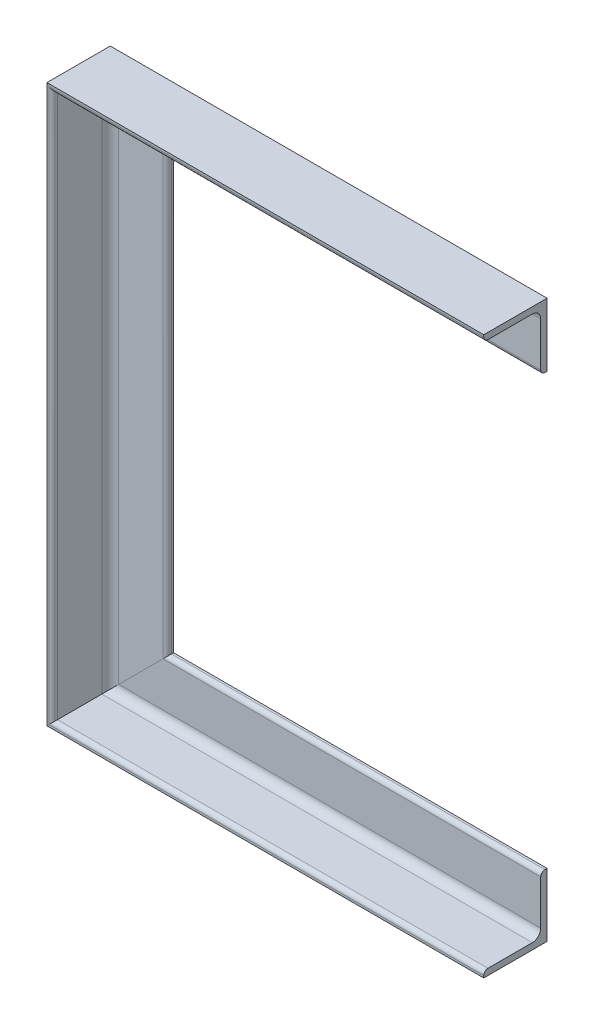
ISO-10303-21;
HEADER;
FILE_DESCRIPTION(('STEP AP214'),'2;1');
FILE_NAME('part.step','',(''),(''),'','','');
FILE_SCHEMA(('AUTOMOTIVE_DESIGN { 1 0 10303 214 1 1 1 1 }'));
ENDSEC;
DATA;
#1=APPLICATION_CONTEXT('core data for automotive mechanical design processes');
#2=APPLICATION_PROTOCOL_DEFINITION('international standard','automotive_design',2000,#1);
#3=PRODUCT_CONTEXT('',#1,'mechanical');
#4=PRODUCT('Part','Part','',(#3));
#5=PRODUCT_RELATED_PRODUCT_CATEGORY('part','',(#4));
#6=PRODUCT_DEFINITION_FORMATION('','',#4);
#7=PRODUCT_DEFINITION_CONTEXT('part definition',#1,'design');
#8=PRODUCT_DEFINITION('design','',#6,#7);
#9=PRODUCT_DEFINITION_SHAPE('','',#8);
#10=(LENGTH_UNIT() NAMED_UNIT(*) SI_UNIT(.MILLI.,.METRE.));
#11=(NAMED_UNIT(*) PLANE_ANGLE_UNIT() SI_UNIT($,.RADIAN.));
#12=(NAMED_UNIT(*) SI_UNIT($,.STERADIAN.) SOLID_ANGLE_UNIT());
#13=UNCERTAINTY_MEASURE_WITH_UNIT(LENGTH_MEASURE(1.E-05),#10,'distance_accuracy_value','');
#14=(GEOMETRIC_REPRESENTATION_CONTEXT(3) GLOBAL_UNCERTAINTY_ASSIGNED_CONTEXT((#13)) GLOBAL_UNIT_ASSIGNED_CONTEXT((#10,
#11,#12)) REPRESENTATION_CONTEXT('',''));
#15=CARTESIAN_POINT('',(0.,0.,0.));
#16=DIRECTION('',(0.,0.,1.));
#17=DIRECTION('',(1.,0.,0.));
#18=AXIS2_PLACEMENT_3D('',#15,#16,#17);
#19=CARTESIAN_POINT('',(-200.,512.,50.));
#20=DIRECTION('',(1.,0.,0.));
#21=DIRECTION('',(0.,1.,0.));
#22=AXIS2_PLACEMENT_3D('',#19,#20,#21);
#23=CYLINDRICAL_SURFACE('',#22,4.);
#24=CARTESIAN_POINT('',(200.,512.,50.));
#25=DIRECTION('',(1.,0.,0.));
#26=DIRECTION('',(0.,1.,0.));
#27=AXIS2_PLACEMENT_3D('',#24,#25,#26);
#28=CIRCLE('',#27,4.);
#29=CARTESIAN_POINT('',(200.,508.,50.));
#30=VERTEX_POINT('',#29);
#31=CARTESIAN_POINT('',(200.,512.,54.));
#32=VERTEX_POINT('',#31);
#33=EDGE_CURVE('P0_E157',#30,#32,#28,.F.);
#34=ORIENTED_EDGE('',*,*,#33,.T.);
#35=DIRECTION('',(1.,0.,0.));
#36=VECTOR('',#35,1.);
#37=CARTESIAN_POINT('',(-200.,512.,54.));
#38=LINE('',#37,#36);
#39=CARTESIAN_POINT('',(-212.,512.,54.));
#40=VERTEX_POINT('',#39);
#41=EDGE_CURVE('P0_E146',#32,#40,#38,.F.);
#42=ORIENTED_EDGE('',*,*,#41,.T.);
#43=CARTESIAN_POINT('',(-212.,512.,50.));
#44=DIRECTION('',(-0.707106781186548,-0.707106781186548,0.));
#45=DIRECTION('',(0.707106781186548,-0.707106781186548,0.));
#46=AXIS2_PLACEMENT_3D('',#43,#44,#45);
#47=ELLIPSE('',#46,5.65685424949238,4.);
#48=CARTESIAN_POINT('',(-208.,508.,50.));
#49=VERTEX_POINT('',#48);
#50=EDGE_CURVE('P0_E149',#49,#40,#47,.T.);
#51=ORIENTED_EDGE('',*,*,#50,.F.);
#52=DIRECTION('',(1.,0.,0.));
#53=VECTOR('',#52,1.);
#54=CARTESIAN_POINT('',(-200.,508.,50.));
#55=LINE('',#54,#53);
#56=EDGE_CURVE('P0_E124',#49,#30,#55,.T.);
#57=ORIENTED_EDGE('',*,*,#56,.T.);
#58=EDGE_LOOP('',(#34,#42,#51,#57));
#59=FACE_BOUND('',#58,.T.);
#60=ADVANCED_FACE('P0_F17',(#59),#23,.T.);
#61=CARTESIAN_POINT('',(-200.,454.,-4.00000000000004));
#62=DIRECTION('',(0.,1.,0.));
#63=DIRECTION('',(0.,0.,1.));
#64=AXIS2_PLACEMENT_3D('',#61,#62,#63);
#65=PLANE('',#64);
#66=DIRECTION('',(1.,0.,0.));
#67=VECTOR('',#66,1.);
#68=CARTESIAN_POINT('',(-200.,454.,-5.99999999999999));
#69=LINE('',#68,#67);
#70=CARTESIAN_POINT('',(-154.,454.,-6.));
#71=VERTEX_POINT('',#70);
#72=CARTESIAN_POINT('',(200.,454.,-6.));
#73=VERTEX_POINT('',#72);
#74=EDGE_CURVE('P0_E115',#71,#73,#69,.T.);
#75=ORIENTED_EDGE('',*,*,#74,.T.);
#76=DIRECTION('',(0.,0.,1.));
#77=VECTOR('',#76,1.);
#78=CARTESIAN_POINT('',(200.,454.,50.));
#79=LINE('',#78,#77);
#80=CARTESIAN_POINT('',(200.,454.,-4.00000000000002));
#81=VERTEX_POINT('',#80);
#82=EDGE_CURVE('P0_E110',#73,#81,#79,.T.);
#83=ORIENTED_EDGE('',*,*,#82,.T.);
#84=DIRECTION('',(1.,0.,0.));
#85=VECTOR('',#84,1.);
#86=CARTESIAN_POINT('',(-200.,454.,-4.00000000000003));
#87=LINE('',#86,#85);
#88=CARTESIAN_POINT('',(-154.,454.,-4.00000000000002));
#89=VERTEX_POINT('',#88);
#90=EDGE_CURVE('P0_E84',#89,#81,#87,.T.);
#91=ORIENTED_EDGE('',*,*,#90,.F.);
#92=DIRECTION('',(0.,0.,1.));
#93=VECTOR('',#92,1.);
#94=CARTESIAN_POINT('',(-154.,454.,0.));
#95=LINE('',#94,#93);
#96=EDGE_CURVE('P0_E131',#71,#89,#95,.T.);
#97=ORIENTED_EDGE('',*,*,#96,.F.);
#98=EDGE_LOOP('',(#75,#83,#91,#97));
#99=FACE_BOUND('',#98,.T.);
#100=ADVANCED_FACE('P0_F201',(#99),#65,.F.);
#101=CARTESIAN_POINT('',(-200.,458.,-4.00000000000001));
#102=DIRECTION('',(1.,0.,0.));
#103=DIRECTION('',(0.,1.,0.));
#104=AXIS2_PLACEMENT_3D('',#101,#102,#103);
#105=CYLINDRICAL_SURFACE('',#104,4.);
#106=CARTESIAN_POINT('',(200.,458.,-4.00000000000001));
#107=DIRECTION('',(1.,0.,0.));
#108=DIRECTION('',(0.,1.,0.));
#109=AXIS2_PLACEMENT_3D('',#106,#107,#108);
#110=CIRCLE('',#109,4.);
#111=CARTESIAN_POINT('',(200.,458.,0.));
#112=VERTEX_POINT('',#111);
#113=EDGE_CURVE('P0_E20',#81,#112,#110,.F.);
#114=ORIENTED_EDGE('',*,*,#113,.T.);
#115=DIRECTION('',(1.,0.,0.));
#116=VECTOR('',#115,1.);
#117=CARTESIAN_POINT('',(-200.,458.,0.));
#118=LINE('',#117,#116);
#119=CARTESIAN_POINT('',(-158.,458.,0.));
#120=VERTEX_POINT('',#119);
#121=EDGE_CURVE('P0_E91',#112,#120,#118,.F.);
#122=ORIENTED_EDGE('',*,*,#121,.T.);
#123=CARTESIAN_POINT('',(-158.,458.,-4.00000000000001));
#124=DIRECTION('',(-0.707106781186548,-0.707106781186548,0.));
#125=DIRECTION('',(0.707106781186548,-0.707106781186548,0.));
#126=AXIS2_PLACEMENT_3D('',#123,#124,#125);
#127=ELLIPSE('',#126,5.65685424949238,4.);
#128=EDGE_CURVE('P0_E168',#89,#120,#127,.T.);
#129=ORIENTED_EDGE('',*,*,#128,.F.);
#130=ORIENTED_EDGE('',*,*,#90,.T.);
#131=EDGE_LOOP('',(#114,#122,#129,#130));
#132=FACE_BOUND('',#131,.T.);
#133=ADVANCED_FACE('P0_F109',(#132),#105,.T.);
#134=CARTESIAN_POINT('',(-200.,500.,0.));
#135=DIRECTION('',(0.,0.,-1.));
#136=DIRECTION('',(0.,1.,0.));
#137=AXIS2_PLACEMENT_3D('',#134,#135,#136);
#138=PLANE('',#137);
#139=ORIENTED_EDGE('',*,*,#121,.F.);
#140=DIRECTION('',(0.,-1.,0.));
#141=VECTOR('',#140,1.);
#142=CARTESIAN_POINT('',(200.,512.,0.));
#143=LINE('',#142,#141);
#144=CARTESIAN_POINT('',(200.,500.,0.));
#145=VERTEX_POINT('',#144);
#146=EDGE_CURVE('P0_E95',#112,#145,#143,.F.);
#147=ORIENTED_EDGE('',*,*,#146,.T.);
#148=DIRECTION('',(1.,0.,0.));
#149=VECTOR('',#148,1.);
#150=CARTESIAN_POINT('',(-200.,500.,0.));
#151=LINE('',#150,#149);
#152=CARTESIAN_POINT('',(-200.,500.,0.));
#153=VERTEX_POINT('',#152);
#154=EDGE_CURVE('P0_E97',#145,#153,#151,.F.);
#155=ORIENTED_EDGE('',*,*,#154,.T.);
#156=DIRECTION('',(0.707106781186548,-0.707106781186548,0.));
#157=VECTOR('',#156,1.);
#158=CARTESIAN_POINT('',(-200.,500.,0.));
#159=LINE('',#158,#157);
#160=EDGE_CURVE('P0_E96',#120,#153,#159,.F.);
#161=ORIENTED_EDGE('',*,*,#160,.F.);
#162=EDGE_LOOP('',(#139,#147,#155,#161));
#163=FACE_BOUND('',#162,.T.);
#164=ADVANCED_FACE('P0_F93',(#163),#138,.F.);
#165=CARTESIAN_POINT('',(-200.,500.,8.));
#166=DIRECTION('',(1.,0.,0.));
#167=DIRECTION('',(0.,1.,0.));
#168=AXIS2_PLACEMENT_3D('',#165,#166,#167);
#169=CYLINDRICAL_SURFACE('',#168,8.);
#170=ORIENTED_EDGE('',*,*,#154,.F.);
#171=CARTESIAN_POINT('',(200.,500.,8.));
#172=DIRECTION('',(1.,0.,0.));
#173=DIRECTION('',(0.,1.,0.));
#174=AXIS2_PLACEMENT_3D('',#171,#172,#173);
#175=CIRCLE('',#174,8.);
#176=CARTESIAN_POINT('',(200.,508.,8.00000000000003));
#177=VERTEX_POINT('',#176);
#178=EDGE_CURVE('P0_E107',#145,#177,#175,.T.);
#179=ORIENTED_EDGE('',*,*,#178,.T.);
#180=DIRECTION('',(1.,0.,0.));
#181=VECTOR('',#180,1.);
#182=CARTESIAN_POINT('',(-200.,508.,8.00000000000006));
#183=LINE('',#182,#181);
#184=CARTESIAN_POINT('',(-208.,508.,8.00000000000003));
#185=VERTEX_POINT('',#184);
#186=EDGE_CURVE('P0_E121',#177,#185,#183,.F.);
#187=ORIENTED_EDGE('',*,*,#186,.T.);
#188=CARTESIAN_POINT('',(-200.,500.,8.));
#189=DIRECTION('',(-0.707106781186548,-0.707106781186548,0.));
#190=DIRECTION('',(0.707106781186548,-0.707106781186548,0.));
#191=AXIS2_PLACEMENT_3D('',#188,#189,#190);
#192=ELLIPSE('',#191,11.3137084989848,8.);
#193=EDGE_CURVE('P0_E166',#153,#185,#192,.F.);
#194=ORIENTED_EDGE('',*,*,#193,.F.);
#195=EDGE_LOOP('',(#170,#179,#187,#194));
#196=FACE_BOUND('',#195,.T.);
#197=ADVANCED_FACE('P0_F202',(#196),#169,.F.);
#198=CARTESIAN_POINT('',(-200.,508.,50.));
#199=DIRECTION('',(0.,1.,0.));
#200=DIRECTION('',(0.,0.,1.));
#201=AXIS2_PLACEMENT_3D('',#198,#199,#200);
#202=PLANE('',#201);
#203=ORIENTED_EDGE('',*,*,#186,.F.);
#204=DIRECTION('',(0.,0.,1.));
#205=VECTOR('',#204,1.);
#206=CARTESIAN_POINT('',(200.,508.,50.));
#207=LINE('',#206,#205);
#208=EDGE_CURVE('P0_E171',#177,#30,#207,.T.);
#209=ORIENTED_EDGE('',*,*,#208,.T.);
#210=ORIENTED_EDGE('',*,*,#56,.F.);
#211=DIRECTION('',(0.,0.,1.));
#212=VECTOR('',#211,1.);
#213=CARTESIAN_POINT('',(-208.,508.,0.));
#214=LINE('',#213,#212);
#215=EDGE_CURVE('P0_E141',#185,#49,#214,.T.);
#216=ORIENTED_EDGE('',*,*,#215,.F.);
#217=EDGE_LOOP('',(#203,#209,#210,#216));
#218=FACE_BOUND('',#217,.T.);
#219=ADVANCED_FACE('P0_F203',(#218),#202,.F.);
#220=CARTESIAN_POINT('',(-200.,514.,-6.));
#221=DIRECTION('',(0.,0.,1.));
#222=DIRECTION('',(0.,-1.,0.));
#223=AXIS2_PLACEMENT_3D('',#220,#221,#222);
#224=PLANE('',#223);
#225=DIRECTION('',(1.,0.,0.));
#226=VECTOR('',#225,1.);
#227=CARTESIAN_POINT('',(-200.,514.,-6.00000000000001));
#228=LINE('',#227,#226);
#229=CARTESIAN_POINT('',(-214.,514.,-6.00000000000001));
#230=VERTEX_POINT('',#229);
#231=CARTESIAN_POINT('',(200.,514.,-6.00000000000001));
#232=VERTEX_POINT('',#231);
#233=EDGE_CURVE('P0_E137',#230,#232,#228,.T.);
#234=ORIENTED_EDGE('',*,*,#233,.T.);
#235=DIRECTION('',(0.,-1.,0.));
#236=VECTOR('',#235,1.);
#237=CARTESIAN_POINT('',(200.,512.,-6.00000000000001));
#238=LINE('',#237,#236);
#239=EDGE_CURVE('P0_E111',#232,#73,#238,.T.);
#240=ORIENTED_EDGE('',*,*,#239,.T.);
#241=ORIENTED_EDGE('',*,*,#74,.F.);
#242=DIRECTION('',(0.707106781186548,-0.707106781186548,0.));
#243=VECTOR('',#242,1.);
#244=CARTESIAN_POINT('',(-200.,500.,-6.00000000000001));
#245=LINE('',#244,#243);
#246=EDGE_CURVE('P0_E128',#230,#71,#245,.T.);
#247=ORIENTED_EDGE('',*,*,#246,.F.);
#248=EDGE_LOOP('',(#234,#240,#241,#247));
#249=FACE_BOUND('',#248,.T.);
#250=ADVANCED_FACE('P0_F198',(#249),#224,.F.);
#251=CARTESIAN_POINT('',(200.,512.,50.));
#252=DIRECTION('',(-1.,0.,0.));
#253=DIRECTION('',(0.,-1.,0.));
#254=AXIS2_PLACEMENT_3D('',#251,#252,#253);
#255=PLANE('',#254);
#256=ORIENTED_EDGE('',*,*,#33,.F.);
#257=ORIENTED_EDGE('',*,*,#208,.F.);
#258=ORIENTED_EDGE('',*,*,#178,.F.);
#259=ORIENTED_EDGE('',*,*,#146,.F.);
#260=ORIENTED_EDGE('',*,*,#113,.F.);
#261=ORIENTED_EDGE('',*,*,#82,.F.);
#262=ORIENTED_EDGE('',*,*,#239,.F.);
#263=DIRECTION('',(0.,0.,-1.));
#264=VECTOR('',#263,1.);
#265=CARTESIAN_POINT('',(200.,514.,54.));
#266=LINE('',#265,#264);
#267=CARTESIAN_POINT('',(200.,514.,54.));
#268=VERTEX_POINT('',#267);
#269=EDGE_CURVE('P0_E140',#232,#268,#266,.F.);
#270=ORIENTED_EDGE('',*,*,#269,.T.);
#271=DIRECTION('',(0.,1.,0.));
#272=VECTOR('',#271,1.);
#273=CARTESIAN_POINT('',(200.,514.,54.));
#274=LINE('',#273,#272);
#275=EDGE_CURVE('P0_E150',#268,#32,#274,.F.);
#276=ORIENTED_EDGE('',*,*,#275,.T.);
#277=EDGE_LOOP('',(#256,#257,#258,#259,#260,#261,#262,#270,#276));
#278=FACE_BOUND('',#277,.T.);
#279=ADVANCED_FACE('P0_F102',(#278),#255,.F.);
#280=CARTESIAN_POINT('',(-200.,514.,54.));
#281=DIRECTION('',(0.,0.,-1.));
#282=DIRECTION('',(0.,1.,0.));
#283=AXIS2_PLACEMENT_3D('',#280,#281,#282);
#284=PLANE('',#283);
#285=ORIENTED_EDGE('',*,*,#41,.F.);
#286=ORIENTED_EDGE('',*,*,#275,.F.);
#287=DIRECTION('',(1.,0.,0.));
#288=VECTOR('',#287,1.);
#289=CARTESIAN_POINT('',(-200.,514.,54.));
#290=LINE('',#289,#288);
#291=CARTESIAN_POINT('',(-214.,514.,54.));
#292=VERTEX_POINT('',#291);
#293=EDGE_CURVE('P0_E26',#268,#292,#290,.F.);
#294=ORIENTED_EDGE('',*,*,#293,.T.);
#295=DIRECTION('',(0.707106781186548,-0.707106781186548,0.));
#296=VECTOR('',#295,1.);
#297=CARTESIAN_POINT('',(-200.,500.,54.));
#298=LINE('',#297,#296);
#299=EDGE_CURVE('P0_E34',#40,#292,#298,.F.);
#300=ORIENTED_EDGE('',*,*,#299,.F.);
#301=EDGE_LOOP('',(#285,#286,#294,#300));
#302=FACE_BOUND('',#301,.T.);
#303=ADVANCED_FACE('P0_F191',(#302),#284,.F.);
#304=CARTESIAN_POINT('',(-200.,500.,0.));
#305=DIRECTION('',(-0.707106781186548,-0.707106781186548,0.));
#306=DIRECTION('',(0.707106781186548,-0.707106781186548,0.));
#307=AXIS2_PLACEMENT_3D('',#304,#305,#306);
#308=PLANE('',#307);
#309=ORIENTED_EDGE('',*,*,#193,.T.);
#310=ORIENTED_EDGE('',*,*,#215,.T.);
#311=ORIENTED_EDGE('',*,*,#50,.T.);
#312=ORIENTED_EDGE('',*,*,#299,.T.);
#313=DIRECTION('',(0.,0.,-1.));
#314=VECTOR('',#313,1.);
#315=CARTESIAN_POINT('',(-214.,514.,54.));
#316=LINE('',#315,#314);
#317=EDGE_CURVE('P0_E11',#292,#230,#316,.T.);
#318=ORIENTED_EDGE('',*,*,#317,.T.);
#319=ORIENTED_EDGE('',*,*,#246,.T.);
#320=ORIENTED_EDGE('',*,*,#96,.T.);
#321=ORIENTED_EDGE('',*,*,#128,.T.);
#322=ORIENTED_EDGE('',*,*,#160,.T.);
#323=EDGE_LOOP('',(#309,#310,#311,#312,#318,#319,#320,#321,#322));
#324=FACE_BOUND('',#323,.T.);
#325=ADVANCED_FACE('P0_F186',(#324),#308,.T.);
#326=CARTESIAN_POINT('',(-200.,514.,54.));
#327=DIRECTION('',(0.,-1.,0.));
#328=DIRECTION('',(0.,0.,-1.));
#329=AXIS2_PLACEMENT_3D('',#326,#327,#328);
#330=PLANE('',#329);
#331=ORIENTED_EDGE('',*,*,#293,.F.);
#332=ORIENTED_EDGE('',*,*,#269,.F.);
#333=ORIENTED_EDGE('',*,*,#233,.F.);
#334=ORIENTED_EDGE('',*,*,#317,.F.);
#335=EDGE_LOOP('',(#331,#332,#333,#334));
#336=FACE_BOUND('',#335,.T.);
#337=ADVANCED_FACE('P0_F195',(#336),#330,.F.);
#338=CLOSED_SHELL('',(#60,#100,#133,#164,#197,#219,#250,#279,#303,#325,#337));
#339=MANIFOLD_SOLID_BREP('P0_B1',#338);
#340=CARTESIAN_POINT('',(200.,-12.0000000000001,50.));
#341=DIRECTION('',(-1.,0.,0.));
#342=DIRECTION('',(0.,0.,1.));
#343=AXIS2_PLACEMENT_3D('',#340,#341,#342);
#344=CYLINDRICAL_SURFACE('',#343,4.);
#345=CARTESIAN_POINT('',(200.,-12.0000000000001,50.));
#346=DIRECTION('',(-1.,0.,0.));
#347=DIRECTION('',(0.,0.,1.));
#348=AXIS2_PLACEMENT_3D('',#345,#346,#347);
#349=CIRCLE('',#348,4.);
#350=CARTESIAN_POINT('',(200.,-8.00000000000006,50.));
#351=VERTEX_POINT('',#350);
#352=CARTESIAN_POINT('',(200.,-12.0000000000001,54.));
#353=VERTEX_POINT('',#352);
#354=EDGE_CURVE('P1_E154',#351,#353,#349,.F.);
#355=ORIENTED_EDGE('',*,*,#354,.F.);
#356=DIRECTION('',(1.,0.,0.));
#357=VECTOR('',#356,1.);
#358=CARTESIAN_POINT('',(200.,-8.00000000000005,50.));
#359=LINE('',#358,#357);
#360=CARTESIAN_POINT('',(-208.,-8.00000000000006,50.));
#361=VERTEX_POINT('',#360);
#362=EDGE_CURVE('P1_E142',#351,#361,#359,.F.);
#363=ORIENTED_EDGE('',*,*,#362,.T.);
#364=CARTESIAN_POINT('',(-212.,-12.0000000000001,50.));
#365=DIRECTION('',(-0.707106781186547,0.707106781186548,0.));
#366=DIRECTION('',(-0.707106781186548,-0.707106781186547,0.));
#367=AXIS2_PLACEMENT_3D('',#364,#365,#366);
#368=ELLIPSE('',#367,5.65685424949238,4.);
#369=CARTESIAN_POINT('',(-212.,-12.0000000000001,54.));
#370=VERTEX_POINT('',#369);
#371=EDGE_CURVE('P1_E170',#370,#361,#368,.T.);
#372=ORIENTED_EDGE('',*,*,#371,.F.);
#373=DIRECTION('',(1.,0.,0.));
#374=VECTOR('',#373,1.);
#375=CARTESIAN_POINT('',(200.,-12.0000000000001,54.));
#376=LINE('',#375,#374);
#377=EDGE_CURVE('P1_E122',#370,#353,#376,.T.);
#378=ORIENTED_EDGE('',*,*,#377,.T.);
#379=EDGE_LOOP('',(#355,#363,#372,#378));
#380=FACE_BOUND('',#379,.T.);
#381=ADVANCED_FACE('P1_F17',(#380),#344,.T.);
#382=CARTESIAN_POINT('',(200.,-8.00000000000005,50.));
#383=DIRECTION('',(0.,-1.,0.));
#384=DIRECTION('',(0.,0.,-1.));
#385=AXIS2_PLACEMENT_3D('',#382,#383,#384);
#386=PLANE('',#385);
#387=ORIENTED_EDGE('',*,*,#362,.F.);
#388=DIRECTION('',(0.,0.,-1.));
#389=VECTOR('',#388,1.);
#390=CARTESIAN_POINT('',(200.,-8.00000000000006,50.));
#391=LINE('',#390,#389);
#392=CARTESIAN_POINT('',(200.,-8.00000000000006,8.00000000000002));
#393=VERTEX_POINT('',#392);
#394=EDGE_CURVE('P1_E113',#393,#351,#391,.F.);
#395=ORIENTED_EDGE('',*,*,#394,.F.);
#396=DIRECTION('',(-1.,0.,0.));
#397=VECTOR('',#396,1.);
#398=CARTESIAN_POINT('',(200.,-8.00000000000005,8.00000000000005));
#399=LINE('',#398,#397);
#400=CARTESIAN_POINT('',(-208.,-8.00000000000005,8.00000000000003));
#401=VERTEX_POINT('',#400);
#402=EDGE_CURVE('P1_E139',#393,#401,#399,.T.);
#403=ORIENTED_EDGE('',*,*,#402,.T.);
#404=DIRECTION('',(0.,0.,1.));
#405=VECTOR('',#404,1.);
#406=CARTESIAN_POINT('',(-208.,-8.00000000000007,0.));
#407=LINE('',#406,#405);
#408=EDGE_CURVE('P1_E169',#361,#401,#407,.F.);
#409=ORIENTED_EDGE('',*,*,#408,.F.);
#410=EDGE_LOOP('',(#387,#395,#403,#409));
#411=FACE_BOUND('',#410,.T.);
#412=ADVANCED_FACE('P1_F222',(#411),#386,.F.);
#413=CARTESIAN_POINT('',(200.,0.,8.));
#414=DIRECTION('',(-1.,0.,0.));
#415=DIRECTION('',(0.,0.,1.));
#416=AXIS2_PLACEMENT_3D('',#413,#414,#415);
#417=CYLINDRICAL_SURFACE('',#416,8.);
#418=ORIENTED_EDGE('',*,*,#402,.F.);
#419=CARTESIAN_POINT('',(200.,0.,8.));
#420=DIRECTION('',(-1.,0.,0.));
#421=DIRECTION('',(0.,0.,1.));
#422=AXIS2_PLACEMENT_3D('',#419,#420,#421);
#423=CIRCLE('',#422,8.);
#424=CARTESIAN_POINT('',(200.,0.,0.));
#425=VERTEX_POINT('',#424);
#426=EDGE_CURVE('P1_E111',#425,#393,#423,.T.);
#427=ORIENTED_EDGE('',*,*,#426,.F.);
#428=DIRECTION('',(1.,0.,0.));
#429=VECTOR('',#428,1.);
#430=CARTESIAN_POINT('',(200.,0.,0.));
#431=LINE('',#430,#429);
#432=CARTESIAN_POINT('',(-200.,0.,0.));
#433=VERTEX_POINT('',#432);
#434=EDGE_CURVE('P1_E98',#425,#433,#431,.F.);
#435=ORIENTED_EDGE('',*,*,#434,.T.);
#436=CARTESIAN_POINT('',(-200.,0.,8.));
#437=DIRECTION('',(-0.707106781186547,0.707106781186548,0.));
#438=DIRECTION('',(-0.707106781186548,-0.707106781186547,0.));
#439=AXIS2_PLACEMENT_3D('',#436,#437,#438);
#440=ELLIPSE('',#439,11.3137084989848,8.);
#441=EDGE_CURVE('P1_E167',#401,#433,#440,.F.);
#442=ORIENTED_EDGE('',*,*,#441,.F.);
#443=EDGE_LOOP('',(#418,#427,#435,#442));
#444=FACE_BOUND('',#443,.T.);
#445=ADVANCED_FACE('P1_F220',(#444),#417,.F.);
#446=CARTESIAN_POINT('',(200.,0.,0.));
#447=DIRECTION('',(0.,0.,-1.));
#448=DIRECTION('',(0.,1.,0.));
#449=AXIS2_PLACEMENT_3D('',#446,#447,#448);
#450=PLANE('',#449);
#451=ORIENTED_EDGE('',*,*,#434,.F.);
#452=DIRECTION('',(0.,1.,0.));
#453=VECTOR('',#452,1.);
#454=CARTESIAN_POINT('',(200.,-12.0000000000001,0.));
#455=LINE('',#454,#453);
#456=CARTESIAN_POINT('',(200.,42.,0.));
#457=VERTEX_POINT('',#456);
#458=EDGE_CURVE('P1_E105',#457,#425,#455,.F.);
#459=ORIENTED_EDGE('',*,*,#458,.F.);
#460=DIRECTION('',(-1.,0.,0.));
#461=VECTOR('',#460,1.);
#462=CARTESIAN_POINT('',(200.,42.,0.));
#463=LINE('',#462,#461);
#464=CARTESIAN_POINT('',(-158.,42.,0.));
#465=VERTEX_POINT('',#464);
#466=EDGE_CURVE('P1_E91',#465,#457,#463,.F.);
#467=ORIENTED_EDGE('',*,*,#466,.F.);
#468=DIRECTION('',(-0.707106781186548,-0.707106781186547,0.));
#469=VECTOR('',#468,1.);
#470=CARTESIAN_POINT('',(-200.,0.,0.));
#471=LINE('',#470,#469);
#472=EDGE_CURVE('P1_E166',#433,#465,#471,.F.);
#473=ORIENTED_EDGE('',*,*,#472,.F.);
#474=EDGE_LOOP('',(#451,#459,#467,#473));
#475=FACE_BOUND('',#474,.T.);
#476=ADVANCED_FACE('P1_F109',(#475),#450,.F.);
#477=CARTESIAN_POINT('',(200.,42.,-3.99999999999999));
#478=DIRECTION('',(-1.,0.,0.));
#479=DIRECTION('',(0.,0.,1.));
#480=AXIS2_PLACEMENT_3D('',#477,#478,#479);
#481=CYLINDRICAL_SURFACE('',#480,4.);
#482=CARTESIAN_POINT('',(200.,42.,-3.99999999999999));
#483=DIRECTION('',(-1.,0.,0.));
#484=DIRECTION('',(0.,0.,1.));
#485=AXIS2_PLACEMENT_3D('',#482,#483,#484);
#486=CIRCLE('',#485,4.);
#487=CARTESIAN_POINT('',(200.,46.,-4.00000000000001));
#488=VERTEX_POINT('',#487);
#489=EDGE_CURVE('P1_E20',#488,#457,#486,.F.);
#490=ORIENTED_EDGE('',*,*,#489,.F.);
#491=DIRECTION('',(1.,0.,0.));
#492=VECTOR('',#491,1.);
#493=CARTESIAN_POINT('',(200.,46.,-4.00000000000003));
#494=LINE('',#493,#492);
#495=CARTESIAN_POINT('',(-154.,45.9999999999999,-4.00000000000001));
#496=VERTEX_POINT('',#495);
#497=EDGE_CURVE('P1_E84',#488,#496,#494,.F.);
#498=ORIENTED_EDGE('',*,*,#497,.T.);
#499=CARTESIAN_POINT('',(-158.,42.,-3.99999999999999));
#500=DIRECTION('',(-0.707106781186547,0.707106781186548,0.));
#501=DIRECTION('',(-0.707106781186548,-0.707106781186547,0.));
#502=AXIS2_PLACEMENT_3D('',#499,#500,#501);
#503=ELLIPSE('',#502,5.65685424949238,4.);
#504=EDGE_CURVE('P1_E94',#465,#496,#503,.T.);
#505=ORIENTED_EDGE('',*,*,#504,.F.);
#506=ORIENTED_EDGE('',*,*,#466,.T.);
#507=EDGE_LOOP('',(#490,#498,#505,#506));
#508=FACE_BOUND('',#507,.T.);
#509=ADVANCED_FACE('P1_F93',(#508),#481,.T.);
#510=CARTESIAN_POINT('',(200.,46.,-4.00000000000003));
#511=DIRECTION('',(0.,-1.,0.));
#512=DIRECTION('',(0.,0.,-1.));
#513=AXIS2_PLACEMENT_3D('',#510,#511,#512);
#514=PLANE('',#513);
#515=ORIENTED_EDGE('',*,*,#497,.F.);
#516=DIRECTION('',(0.,0.,-1.));
#517=VECTOR('',#516,1.);
#518=CARTESIAN_POINT('',(200.,46.,50.));
#519=LINE('',#518,#517);
#520=CARTESIAN_POINT('',(200.,45.9999999999999,-6.));
#521=VERTEX_POINT('',#520);
#522=EDGE_CURVE('P1_E108',#521,#488,#519,.F.);
#523=ORIENTED_EDGE('',*,*,#522,.F.);
#524=DIRECTION('',(1.,0.,0.));
#525=VECTOR('',#524,1.);
#526=CARTESIAN_POINT('',(200.,46.,-6.));
#527=LINE('',#526,#525);
#528=CARTESIAN_POINT('',(-154.,45.9999999999999,-6.));
#529=VERTEX_POINT('',#528);
#530=EDGE_CURVE('P1_E126',#521,#529,#527,.F.);
#531=ORIENTED_EDGE('',*,*,#530,.T.);
#532=DIRECTION('',(0.,0.,1.));
#533=VECTOR('',#532,1.);
#534=CARTESIAN_POINT('',(-154.,45.9999999999999,0.));
#535=LINE('',#534,#533);
#536=EDGE_CURVE('P1_E135',#496,#529,#535,.F.);
#537=ORIENTED_EDGE('',*,*,#536,.F.);
#538=EDGE_LOOP('',(#515,#523,#531,#537));
#539=FACE_BOUND('',#538,.T.);
#540=ADVANCED_FACE('P1_F193',(#539),#514,.F.);
#541=CARTESIAN_POINT('',(200.,-14.0000000000001,54.));
#542=DIRECTION('',(0.,0.,-1.));
#543=DIRECTION('',(0.,1.,0.));
#544=AXIS2_PLACEMENT_3D('',#541,#542,#543);
#545=PLANE('',#544);
#546=DIRECTION('',(1.,0.,0.));
#547=VECTOR('',#546,1.);
#548=CARTESIAN_POINT('',(200.,-14.0000000000001,54.));
#549=LINE('',#548,#547);
#550=CARTESIAN_POINT('',(-214.,-14.,54.));
#551=VERTEX_POINT('',#550);
#552=CARTESIAN_POINT('',(200.,-14.0000000000001,54.));
#553=VERTEX_POINT('',#552);
#554=EDGE_CURVE('P1_E134',#551,#553,#549,.T.);
#555=ORIENTED_EDGE('',*,*,#554,.T.);
#556=DIRECTION('',(0.,1.,0.));
#557=VECTOR('',#556,1.);
#558=CARTESIAN_POINT('',(200.,-12.0000000000001,54.));
#559=LINE('',#558,#557);
#560=EDGE_CURVE('P1_E118',#353,#553,#559,.F.);
#561=ORIENTED_EDGE('',*,*,#560,.F.);
#562=ORIENTED_EDGE('',*,*,#377,.F.);
#563=DIRECTION('',(-0.707106781186548,-0.707106781186547,0.));
#564=VECTOR('',#563,1.);
#565=CARTESIAN_POINT('',(-200.,0.,54.));
#566=LINE('',#565,#564);
#567=EDGE_CURVE('P1_E129',#551,#370,#566,.F.);
#568=ORIENTED_EDGE('',*,*,#567,.F.);
#569=EDGE_LOOP('',(#555,#561,#562,#568));
#570=FACE_BOUND('',#569,.T.);
#571=ADVANCED_FACE('P1_F183',(#570),#545,.F.);
#572=CARTESIAN_POINT('',(200.,-12.0000000000001,50.));
#573=DIRECTION('',(1.,0.,0.));
#574=DIRECTION('',(0.,0.,-1.));
#575=AXIS2_PLACEMENT_3D('',#572,#573,#574);
#576=PLANE('',#575);
#577=ORIENTED_EDGE('',*,*,#394,.T.);
#578=ORIENTED_EDGE('',*,*,#354,.T.);
#579=ORIENTED_EDGE('',*,*,#560,.T.);
#580=DIRECTION('',(0.,0.,1.));
#581=VECTOR('',#580,1.);
#582=CARTESIAN_POINT('',(200.,-14.0000000000001,54.));
#583=LINE('',#582,#581);
#584=CARTESIAN_POINT('',(200.,-14.0000000000001,-6.));
#585=VERTEX_POINT('',#584);
#586=EDGE_CURVE('P1_E148',#553,#585,#583,.F.);
#587=ORIENTED_EDGE('',*,*,#586,.T.);
#588=DIRECTION('',(0.,-1.,0.));
#589=VECTOR('',#588,1.);
#590=CARTESIAN_POINT('',(200.,-14.0000000000001,-6.));
#591=LINE('',#590,#589);
#592=EDGE_CURVE('P1_E130',#585,#521,#591,.F.);
#593=ORIENTED_EDGE('',*,*,#592,.T.);
#594=ORIENTED_EDGE('',*,*,#522,.T.);
#595=ORIENTED_EDGE('',*,*,#489,.T.);
#596=ORIENTED_EDGE('',*,*,#458,.T.);
#597=ORIENTED_EDGE('',*,*,#426,.T.);
#598=EDGE_LOOP('',(#577,#578,#579,#587,#593,#594,#595,#596,#597));
#599=FACE_BOUND('',#598,.T.);
#600=ADVANCED_FACE('P1_F103',(#599),#576,.T.);
#601=CARTESIAN_POINT('',(200.,-14.0000000000001,-6.));
#602=DIRECTION('',(0.,0.,1.));
#603=DIRECTION('',(0.,-1.,0.));
#604=AXIS2_PLACEMENT_3D('',#601,#602,#603);
#605=PLANE('',#604);
#606=ORIENTED_EDGE('',*,*,#530,.F.);
#607=ORIENTED_EDGE('',*,*,#592,.F.);
#608=DIRECTION('',(1.,0.,0.));
#609=VECTOR('',#608,1.);
#610=CARTESIAN_POINT('',(200.,-14.0000000000001,-6.00000000000001));
#611=LINE('',#610,#609);
#612=CARTESIAN_POINT('',(-214.,-14.,-6.));
#613=VERTEX_POINT('',#612);
#614=EDGE_CURVE('P1_E26',#585,#613,#611,.F.);
#615=ORIENTED_EDGE('',*,*,#614,.T.);
#616=DIRECTION('',(-0.707106781186548,-0.707106781186547,0.));
#617=VECTOR('',#616,1.);
#618=CARTESIAN_POINT('',(-200.,0.,-6.00000000000001));
#619=LINE('',#618,#617);
#620=EDGE_CURVE('P1_E34',#529,#613,#619,.T.);
#621=ORIENTED_EDGE('',*,*,#620,.F.);
#622=EDGE_LOOP('',(#606,#607,#615,#621));
#623=FACE_BOUND('',#622,.T.);
#624=ADVANCED_FACE('P1_F195',(#623),#605,.F.);
#625=CARTESIAN_POINT('',(-200.,0.,0.));
#626=DIRECTION('',(-0.707106781186547,0.707106781186548,0.));
#627=DIRECTION('',(-0.707106781186548,-0.707106781186547,0.));
#628=AXIS2_PLACEMENT_3D('',#625,#626,#627);
#629=PLANE('',#628);
#630=ORIENTED_EDGE('',*,*,#536,.T.);
#631=ORIENTED_EDGE('',*,*,#620,.T.);
#632=DIRECTION('',(0.,0.,1.));
#633=VECTOR('',#632,1.);
#634=CARTESIAN_POINT('',(-214.,-14.0000000000001,54.));
#635=LINE('',#634,#633);
#636=EDGE_CURVE('P1_E11',#613,#551,#635,.T.);
#637=ORIENTED_EDGE('',*,*,#636,.T.);
#638=ORIENTED_EDGE('',*,*,#567,.T.);
#639=ORIENTED_EDGE('',*,*,#371,.T.);
#640=ORIENTED_EDGE('',*,*,#408,.T.);
#641=ORIENTED_EDGE('',*,*,#441,.T.);
#642=ORIENTED_EDGE('',*,*,#472,.T.);
#643=ORIENTED_EDGE('',*,*,#504,.T.);
#644=EDGE_LOOP('',(#630,#631,#637,#638,#639,#640,#641,#642,#643));
#645=FACE_BOUND('',#644,.T.);
#646=ADVANCED_FACE('P1_F184',(#645),#629,.T.);
#647=CARTESIAN_POINT('',(200.,-14.0000000000001,54.));
#648=DIRECTION('',(0.,1.,0.));
#649=DIRECTION('',(0.,0.,1.));
#650=AXIS2_PLACEMENT_3D('',#647,#648,#649);
#651=PLANE('',#650);
#652=ORIENTED_EDGE('',*,*,#614,.F.);
#653=ORIENTED_EDGE('',*,*,#586,.F.);
#654=ORIENTED_EDGE('',*,*,#554,.F.);
#655=ORIENTED_EDGE('',*,*,#636,.F.);
#656=EDGE_LOOP('',(#652,#653,#654,#655));
#657=FACE_BOUND('',#656,.T.);
#658=ADVANCED_FACE('P1_F199',(#657),#651,.F.);
#659=CLOSED_SHELL('',(#381,#412,#445,#476,#509,#540,#571,#600,#624,#646,#658));
#660=MANIFOLD_SOLID_BREP('P1_B1',#659);
#661=CARTESIAN_POINT('',(-212.,0.,50.));
#662=DIRECTION('',(0.,1.,0.));
#663=DIRECTION('',(-1.,0.,0.));
#664=AXIS2_PLACEMENT_3D('',#661,#662,#663);
#665=CYLINDRICAL_SURFACE('',#664,4.);
#666=CARTESIAN_POINT('',(-212.,-12.,50.));
#667=DIRECTION('',(0.707106781186547,-0.707106781186548,0.));
#668=DIRECTION('',(0.707106781186548,0.707106781186547,0.));
#669=AXIS2_PLACEMENT_3D('',#666,#667,#668);
#670=ELLIPSE('',#669,5.65685424949238,4.);
#671=CARTESIAN_POINT('',(-208.,-8.00000000000006,50.));
#672=VERTEX_POINT('',#671);
#673=CARTESIAN_POINT('',(-212.,-12.0000000000001,54.));
#674=VERTEX_POINT('',#673);
#675=EDGE_CURVE('P2_E20',#672,#674,#670,.T.);
#676=ORIENTED_EDGE('',*,*,#675,.F.);
#677=DIRECTION('',(0.,-1.,0.));
#678=VECTOR('',#677,1.);
#679=CARTESIAN_POINT('',(-208.,0.,50.));
#680=LINE('',#679,#678);
#681=CARTESIAN_POINT('',(-208.,508.,50.));
#682=VERTEX_POINT('',#681);
#683=EDGE_CURVE('P2_E85',#672,#682,#680,.F.);
#684=ORIENTED_EDGE('',*,*,#683,.T.);
#685=CARTESIAN_POINT('',(-212.,512.,50.));
#686=DIRECTION('',(0.707106781186548,0.707106781186547,0.));
#687=DIRECTION('',(-0.707106781186547,0.707106781186548,0.));
#688=AXIS2_PLACEMENT_3D('',#685,#686,#687);
#689=ELLIPSE('',#688,5.65685424949239,4.);
#690=CARTESIAN_POINT('',(-212.,512.,54.));
#691=VERTEX_POINT('',#690);
#692=EDGE_CURVE('P2_E101',#691,#682,#689,.T.);
#693=ORIENTED_EDGE('',*,*,#692,.F.);
#694=DIRECTION('',(0.,1.,0.));
#695=VECTOR('',#694,1.);
#696=CARTESIAN_POINT('',(-212.,0.,54.));
#697=LINE('',#696,#695);
#698=EDGE_CURVE('P2_E99',#691,#674,#697,.F.);
#699=ORIENTED_EDGE('',*,*,#698,.T.);
#700=EDGE_LOOP('',(#676,#684,#693,#699));
#701=FACE_BOUND('',#700,.T.);
#702=ADVANCED_FACE('P2_F17',(#701),#665,.T.);
#703=CARTESIAN_POINT('',(-208.,0.,50.));
#704=DIRECTION('',(-1.,0.,0.));
#705=DIRECTION('',(0.,-1.,0.));
#706=AXIS2_PLACEMENT_3D('',#703,#704,#705);
#707=PLANE('',#706);
#708=ORIENTED_EDGE('',*,*,#683,.F.);
#709=DIRECTION('',(0.,0.,1.));
#710=VECTOR('',#709,1.);
#711=CARTESIAN_POINT('',(-208.,-8.00000000000007,0.));
#712=LINE('',#711,#710);
#713=CARTESIAN_POINT('',(-208.,-8.00000000000006,8.));
#714=VERTEX_POINT('',#713);
#715=EDGE_CURVE('P2_E97',#714,#672,#712,.T.);
#716=ORIENTED_EDGE('',*,*,#715,.F.);
#717=DIRECTION('',(0.,1.,0.));
#718=VECTOR('',#717,1.);
#719=CARTESIAN_POINT('',(-208.,0.,8.));
#720=LINE('',#719,#718);
#721=CARTESIAN_POINT('',(-208.,508.,8.));
#722=VERTEX_POINT('',#721);
#723=EDGE_CURVE('P2_E138',#714,#722,#720,.T.);
#724=ORIENTED_EDGE('',*,*,#723,.T.);
#725=DIRECTION('',(0.,0.,1.));
#726=VECTOR('',#725,1.);
#727=CARTESIAN_POINT('',(-208.,508.,0.));
#728=LINE('',#727,#726);
#729=EDGE_CURVE('P2_E164',#682,#722,#728,.F.);
#730=ORIENTED_EDGE('',*,*,#729,.F.);
#731=EDGE_LOOP('',(#708,#716,#724,#730));
#732=FACE_BOUND('',#731,.T.);
#733=ADVANCED_FACE('P2_F203',(#732),#707,.F.);
#734=CARTESIAN_POINT('',(-200.,0.,8.));
#735=DIRECTION('',(0.,1.,0.));
#736=DIRECTION('',(-1.,0.,0.));
#737=AXIS2_PLACEMENT_3D('',#734,#735,#736);
#738=CYLINDRICAL_SURFACE('',#737,8.00000000000001);
#739=ORIENTED_EDGE('',*,*,#723,.F.);
#740=CARTESIAN_POINT('',(-200.,0.,8.));
#741=DIRECTION('',(0.707106781186547,-0.707106781186548,0.));
#742=DIRECTION('',(0.707106781186548,0.707106781186547,0.));
#743=AXIS2_PLACEMENT_3D('',#740,#741,#742);
#744=ELLIPSE('',#743,11.3137084989848,8.00000000000001);
#745=CARTESIAN_POINT('',(-200.,0.,0.));
#746=VERTEX_POINT('',#745);
#747=EDGE_CURVE('P2_E166',#746,#714,#744,.F.);
#748=ORIENTED_EDGE('',*,*,#747,.F.);
#749=DIRECTION('',(0.,1.,0.));
#750=VECTOR('',#749,1.);
#751=CARTESIAN_POINT('',(-200.,0.,0.));
#752=LINE('',#751,#750);
#753=CARTESIAN_POINT('',(-200.,500.,0.));
#754=VERTEX_POINT('',#753);
#755=EDGE_CURVE('P2_E135',#746,#754,#752,.T.);
#756=ORIENTED_EDGE('',*,*,#755,.T.);
#757=CARTESIAN_POINT('',(-200.,500.,8.));
#758=DIRECTION('',(0.707106781186548,0.707106781186547,0.));
#759=DIRECTION('',(-0.707106781186547,0.707106781186548,0.));
#760=AXIS2_PLACEMENT_3D('',#757,#758,#759);
#761=ELLIPSE('',#760,11.3137084989848,8.00000000000001);
#762=EDGE_CURVE('P2_E162',#722,#754,#761,.F.);
#763=ORIENTED_EDGE('',*,*,#762,.F.);
#764=EDGE_LOOP('',(#739,#748,#756,#763));
#765=FACE_BOUND('',#764,.T.);
#766=ADVANCED_FACE('P2_F202',(#765),#738,.F.);
#767=CARTESIAN_POINT('',(-200.,0.,0.));
#768=DIRECTION('',(0.,0.,-1.));
#769=DIRECTION('',(-1.,0.,0.));
#770=AXIS2_PLACEMENT_3D('',#767,#768,#769);
#771=PLANE('',#770);
#772=ORIENTED_EDGE('',*,*,#755,.F.);
#773=DIRECTION('',(0.707106781186548,0.707106781186547,0.));
#774=VECTOR('',#773,1.);
#775=CARTESIAN_POINT('',(-200.,0.,0.));
#776=LINE('',#775,#774);
#777=CARTESIAN_POINT('',(-158.,41.9999999999999,0.));
#778=VERTEX_POINT('',#777);
#779=EDGE_CURVE('P2_E167',#778,#746,#776,.F.);
#780=ORIENTED_EDGE('',*,*,#779,.F.);
#781=DIRECTION('',(0.,1.,0.));
#782=VECTOR('',#781,1.);
#783=CARTESIAN_POINT('',(-158.,0.,0.));
#784=LINE('',#783,#782);
#785=CARTESIAN_POINT('',(-158.,458.,0.));
#786=VERTEX_POINT('',#785);
#787=EDGE_CURVE('P2_E122',#786,#778,#784,.F.);
#788=ORIENTED_EDGE('',*,*,#787,.F.);
#789=DIRECTION('',(-0.707106781186547,0.707106781186548,0.));
#790=VECTOR('',#789,1.);
#791=CARTESIAN_POINT('',(-200.,500.,0.));
#792=LINE('',#791,#790);
#793=EDGE_CURVE('P2_E161',#754,#786,#792,.F.);
#794=ORIENTED_EDGE('',*,*,#793,.F.);
#795=EDGE_LOOP('',(#772,#780,#788,#794));
#796=FACE_BOUND('',#795,.T.);
#797=ADVANCED_FACE('P2_F199',(#796),#771,.F.);
#798=CARTESIAN_POINT('',(-158.,0.,-4.));
#799=DIRECTION('',(0.,1.,0.));
#800=DIRECTION('',(-1.,0.,0.));
#801=AXIS2_PLACEMENT_3D('',#798,#799,#800);
#802=CYLINDRICAL_SURFACE('',#801,4.);
#803=CARTESIAN_POINT('',(-158.,41.9999999999999,-4.));
#804=DIRECTION('',(0.707106781186547,-0.707106781186548,0.));
#805=DIRECTION('',(0.707106781186548,0.707106781186547,0.));
#806=AXIS2_PLACEMENT_3D('',#803,#804,#805);
#807=ELLIPSE('',#806,5.65685424949238,4.);
#808=CARTESIAN_POINT('',(-154.,45.9999999999999,-4.00000000000001));
#809=VERTEX_POINT('',#808);
#810=EDGE_CURVE('P2_E113',#809,#778,#807,.T.);
#811=ORIENTED_EDGE('',*,*,#810,.F.);
#812=DIRECTION('',(0.,-1.,0.));
#813=VECTOR('',#812,1.);
#814=CARTESIAN_POINT('',(-154.,0.,-4.00000000000003));
#815=LINE('',#814,#813);
#816=CARTESIAN_POINT('',(-154.,454.,-4.00000000000001));
#817=VERTEX_POINT('',#816);
#818=EDGE_CURVE('P2_E105',#809,#817,#815,.F.);
#819=ORIENTED_EDGE('',*,*,#818,.T.);
#820=CARTESIAN_POINT('',(-158.,458.,-4.));
#821=DIRECTION('',(0.707106781186548,0.707106781186547,0.));
#822=DIRECTION('',(-0.707106781186547,0.707106781186548,0.));
#823=AXIS2_PLACEMENT_3D('',#820,#821,#822);
#824=ELLIPSE('',#823,5.65685424949239,4.);
#825=EDGE_CURVE('P2_E159',#786,#817,#824,.T.);
#826=ORIENTED_EDGE('',*,*,#825,.F.);
#827=ORIENTED_EDGE('',*,*,#787,.T.);
#828=EDGE_LOOP('',(#811,#819,#826,#827));
#829=FACE_BOUND('',#828,.T.);
#830=ADVANCED_FACE('P2_F195',(#829),#802,.T.);
#831=CARTESIAN_POINT('',(-154.,0.,-4.00000000000003));
#832=DIRECTION('',(-1.,0.,0.));
#833=DIRECTION('',(0.,-1.,0.));
#834=AXIS2_PLACEMENT_3D('',#831,#832,#833);
#835=PLANE('',#834);
#836=ORIENTED_EDGE('',*,*,#818,.F.);
#837=DIRECTION('',(0.,0.,1.));
#838=VECTOR('',#837,1.);
#839=CARTESIAN_POINT('',(-154.,46.,0.));
#840=LINE('',#839,#838);
#841=CARTESIAN_POINT('',(-154.,45.9999999999999,-6.));
#842=VERTEX_POINT('',#841);
#843=EDGE_CURVE('P2_E110',#842,#809,#840,.T.);
#844=ORIENTED_EDGE('',*,*,#843,.F.);
#845=DIRECTION('',(0.,1.,0.));
#846=VECTOR('',#845,1.);
#847=CARTESIAN_POINT('',(-154.,0.,-6.));
#848=LINE('',#847,#846);
#849=CARTESIAN_POINT('',(-154.,454.,-6.));
#850=VERTEX_POINT('',#849);
#851=EDGE_CURVE('P2_E123',#842,#850,#848,.T.);
#852=ORIENTED_EDGE('',*,*,#851,.T.);
#853=DIRECTION('',(0.,0.,1.));
#854=VECTOR('',#853,1.);
#855=CARTESIAN_POINT('',(-154.,454.,0.));
#856=LINE('',#855,#854);
#857=EDGE_CURVE('P2_E131',#817,#850,#856,.F.);
#858=ORIENTED_EDGE('',*,*,#857,.F.);
#859=EDGE_LOOP('',(#836,#844,#852,#858));
#860=FACE_BOUND('',#859,.T.);
#861=ADVANCED_FACE('P2_F188',(#860),#835,.F.);
#862=CARTESIAN_POINT('',(-214.,0.,54.));
#863=DIRECTION('',(0.,0.,-1.));
#864=DIRECTION('',(-1.,0.,0.));
#865=AXIS2_PLACEMENT_3D('',#862,#863,#864);
#866=PLANE('',#865);
#867=DIRECTION('',(0.,1.,0.));
#868=VECTOR('',#867,1.);
#869=CARTESIAN_POINT('',(-214.,0.,54.));
#870=LINE('',#869,#868);
#871=CARTESIAN_POINT('',(-214.,514.,54.));
#872=VERTEX_POINT('',#871);
#873=CARTESIAN_POINT('',(-214.,-14.,54.));
#874=VERTEX_POINT('',#873);
#875=EDGE_CURVE('P2_E109',#872,#874,#870,.F.);
#876=ORIENTED_EDGE('',*,*,#875,.T.);
#877=DIRECTION('',(0.707106781186548,0.707106781186547,0.));
#878=VECTOR('',#877,1.);
#879=CARTESIAN_POINT('',(-200.,0.,54.));
#880=LINE('',#879,#878);
#881=EDGE_CURVE('P2_E95',#674,#874,#880,.F.);
#882=ORIENTED_EDGE('',*,*,#881,.F.);
#883=ORIENTED_EDGE('',*,*,#698,.F.);
#884=DIRECTION('',(-0.707106781186547,0.707106781186548,0.));
#885=VECTOR('',#884,1.);
#886=CARTESIAN_POINT('',(-200.,500.,54.));
#887=LINE('',#886,#885);
#888=EDGE_CURVE('P2_E126',#872,#691,#887,.F.);
#889=ORIENTED_EDGE('',*,*,#888,.F.);
#890=EDGE_LOOP('',(#876,#882,#883,#889));
#891=FACE_BOUND('',#890,.T.);
#892=ADVANCED_FACE('P2_F108',(#891),#866,.F.);
#893=CARTESIAN_POINT('',(-200.,0.,0.));
#894=DIRECTION('',(0.707106781186547,-0.707106781186548,0.));
#895=DIRECTION('',(0.707106781186548,0.707106781186547,0.));
#896=AXIS2_PLACEMENT_3D('',#893,#894,#895);
#897=PLANE('',#896);
#898=ORIENTED_EDGE('',*,*,#747,.T.);
#899=ORIENTED_EDGE('',*,*,#715,.T.);
#900=ORIENTED_EDGE('',*,*,#675,.T.);
#901=ORIENTED_EDGE('',*,*,#881,.T.);
#902=DIRECTION('',(0.,0.,1.));
#903=VECTOR('',#902,1.);
#904=CARTESIAN_POINT('',(-214.,-14.,54.));
#905=LINE('',#904,#903);
#906=CARTESIAN_POINT('',(-214.,-14.,-6.));
#907=VERTEX_POINT('',#906);
#908=EDGE_CURVE('P2_E143',#874,#907,#905,.F.);
#909=ORIENTED_EDGE('',*,*,#908,.T.);
#910=DIRECTION('',(0.707106781186548,0.707106781186547,0.));
#911=VECTOR('',#910,1.);
#912=CARTESIAN_POINT('',(-214.,-14.,-6.));
#913=LINE('',#912,#911);
#914=EDGE_CURVE('P2_E127',#907,#842,#913,.T.);
#915=ORIENTED_EDGE('',*,*,#914,.T.);
#916=ORIENTED_EDGE('',*,*,#843,.T.);
#917=ORIENTED_EDGE('',*,*,#810,.T.);
#918=ORIENTED_EDGE('',*,*,#779,.T.);
#919=EDGE_LOOP('',(#898,#899,#900,#901,#909,#915,#916,#917,#918));
#920=FACE_BOUND('',#919,.T.);
#921=ADVANCED_FACE('P2_F92',(#920),#897,.T.);
#922=CARTESIAN_POINT('',(-214.,0.,-6.));
#923=DIRECTION('',(0.,0.,1.));
#924=DIRECTION('',(1.,0.,0.));
#925=AXIS2_PLACEMENT_3D('',#922,#923,#924);
#926=PLANE('',#925);
#927=ORIENTED_EDGE('',*,*,#851,.F.);
#928=ORIENTED_EDGE('',*,*,#914,.F.);
#929=DIRECTION('',(0.,1.,0.));
#930=VECTOR('',#929,1.);
#931=CARTESIAN_POINT('',(-214.,0.,-6.));
#932=LINE('',#931,#930);
#933=CARTESIAN_POINT('',(-214.,514.,-6.));
#934=VERTEX_POINT('',#933);
#935=EDGE_CURVE('P2_E26',#907,#934,#932,.T.);
#936=ORIENTED_EDGE('',*,*,#935,.T.);
#937=DIRECTION('',(-0.707106781186547,0.707106781186548,0.));
#938=VECTOR('',#937,1.);
#939=CARTESIAN_POINT('',(-200.,500.,-6.));
#940=LINE('',#939,#938);
#941=EDGE_CURVE('P2_E34',#850,#934,#940,.T.);
#942=ORIENTED_EDGE('',*,*,#941,.F.);
#943=EDGE_LOOP('',(#927,#928,#936,#942));
#944=FACE_BOUND('',#943,.T.);
#945=ADVANCED_FACE('P2_F190',(#944),#926,.F.);
#946=CARTESIAN_POINT('',(-200.,500.,0.));
#947=DIRECTION('',(0.707106781186548,0.707106781186547,0.));
#948=DIRECTION('',(-0.707106781186547,0.707106781186548,0.));
#949=AXIS2_PLACEMENT_3D('',#946,#947,#948);
#950=PLANE('',#949);
#951=ORIENTED_EDGE('',*,*,#857,.T.);
#952=ORIENTED_EDGE('',*,*,#941,.T.);
#953=DIRECTION('',(0.,0.,1.));
#954=VECTOR('',#953,1.);
#955=CARTESIAN_POINT('',(-214.,514.,54.));
#956=LINE('',#955,#954);
#957=EDGE_CURVE('P2_E11',#934,#872,#956,.T.);
#958=ORIENTED_EDGE('',*,*,#957,.T.);
#959=ORIENTED_EDGE('',*,*,#888,.T.);
#960=ORIENTED_EDGE('',*,*,#692,.T.);
#961=ORIENTED_EDGE('',*,*,#729,.T.);
#962=ORIENTED_EDGE('',*,*,#762,.T.);
#963=ORIENTED_EDGE('',*,*,#793,.T.);
#964=ORIENTED_EDGE('',*,*,#825,.T.);
#965=EDGE_LOOP('',(#951,#952,#958,#959,#960,#961,#962,#963,#964));
#966=FACE_BOUND('',#965,.T.);
#967=ADVANCED_FACE('P2_F184',(#966),#950,.T.);
#968=CARTESIAN_POINT('',(-214.,0.,54.));
#969=DIRECTION('',(1.,0.,0.));
#970=DIRECTION('',(0.,1.,0.));
#971=AXIS2_PLACEMENT_3D('',#968,#969,#970);
#972=PLANE('',#971);
#973=ORIENTED_EDGE('',*,*,#935,.F.);
#974=ORIENTED_EDGE('',*,*,#908,.F.);
#975=ORIENTED_EDGE('',*,*,#875,.F.);
#976=ORIENTED_EDGE('',*,*,#957,.F.);
#977=EDGE_LOOP('',(#973,#974,#975,#976));
#978=FACE_BOUND('',#977,.T.);
#979=ADVANCED_FACE('P2_F193',(#978),#972,.F.);
#980=CLOSED_SHELL('',(#702,#733,#766,#797,#830,#861,#892,#921,#945,#967,#979));
#981=MANIFOLD_SOLID_BREP('P2_B1',#980);
#982=ADVANCED_BREP_SHAPE_REPRESENTATION('',(#18,#339,#660,#981),#14);
#983=SHAPE_DEFINITION_REPRESENTATION(#9,#982);
ENDSEC;
END-ISO-10303-21;
